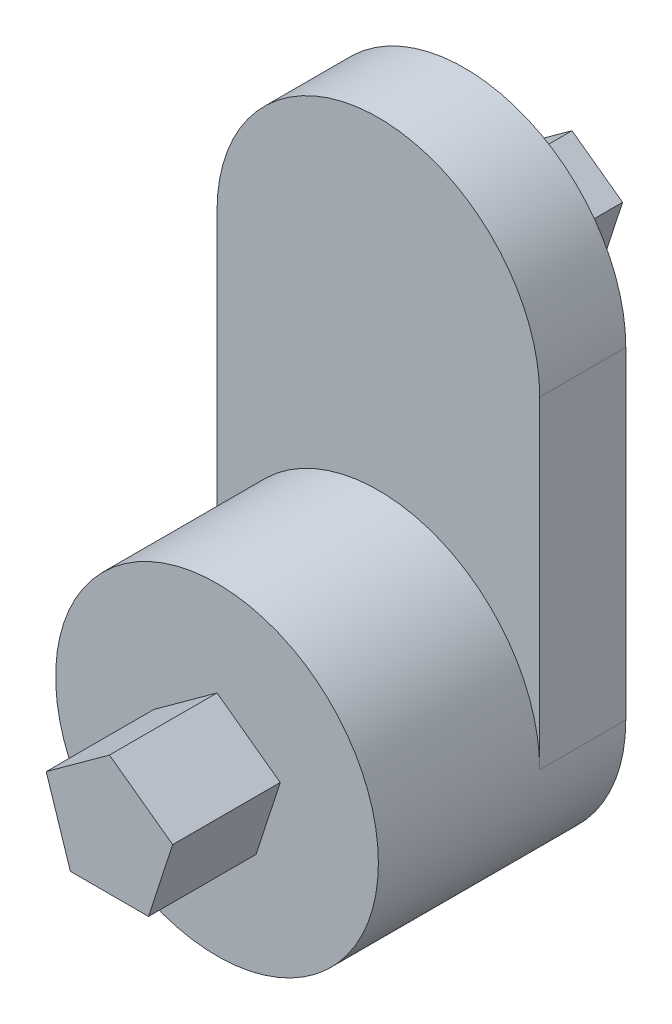
ISO-10303-21;
HEADER;
FILE_DESCRIPTION(('STEP AP214'),'2;1');
FILE_NAME('part.step','',(''),(''),'','','');
FILE_SCHEMA(('AUTOMOTIVE_DESIGN { 1 0 10303 214 1 1 1 1 }'));
ENDSEC;
DATA;
#1=APPLICATION_CONTEXT('core data for automotive mechanical design processes');
#2=APPLICATION_PROTOCOL_DEFINITION('international standard','automotive_design',2000,#1);
#3=PRODUCT_CONTEXT('',#1,'mechanical');
#4=PRODUCT('Part','Part','',(#3));
#5=PRODUCT_RELATED_PRODUCT_CATEGORY('part','',(#4));
#6=PRODUCT_DEFINITION_FORMATION('','',#4);
#7=PRODUCT_DEFINITION_CONTEXT('part definition',#1,'design');
#8=PRODUCT_DEFINITION('design','',#6,#7);
#9=PRODUCT_DEFINITION_SHAPE('','',#8);
#10=(LENGTH_UNIT() NAMED_UNIT(*) SI_UNIT(.MILLI.,.METRE.));
#11=(NAMED_UNIT(*) PLANE_ANGLE_UNIT() SI_UNIT($,.RADIAN.));
#12=(NAMED_UNIT(*) SI_UNIT($,.STERADIAN.) SOLID_ANGLE_UNIT());
#13=UNCERTAINTY_MEASURE_WITH_UNIT(LENGTH_MEASURE(1.E-05),#10,'distance_accuracy_value','');
#14=(GEOMETRIC_REPRESENTATION_CONTEXT(3) GLOBAL_UNCERTAINTY_ASSIGNED_CONTEXT((#13)) GLOBAL_UNIT_ASSIGNED_CONTEXT((#10,
#11,#12)) REPRESENTATION_CONTEXT('',''));
#15=CARTESIAN_POINT('',(0.,0.,0.));
#16=DIRECTION('',(0.,0.,1.));
#17=DIRECTION('',(1.,0.,0.));
#18=AXIS2_PLACEMENT_3D('',#15,#16,#17);
#19=CARTESIAN_POINT('',(0.,0.,-25.));
#20=DIRECTION('',(0.,0.,1.));
#21=DIRECTION('',(1.,0.,0.));
#22=AXIS2_PLACEMENT_3D('',#19,#20,#21);
#23=CYLINDRICAL_SURFACE('',#22,15.);
#24=CARTESIAN_POINT('',(0.,0.,-25.));
#25=DIRECTION('',(0.,0.,1.));
#26=DIRECTION('',(1.,0.,0.));
#27=AXIS2_PLACEMENT_3D('',#24,#25,#26);
#28=CIRCLE('',#27,15.);
#29=CARTESIAN_POINT('',(15.,0.,-25.));
#30=VERTEX_POINT('',#29);
#31=CARTESIAN_POINT('',(-15.,0.,-25.));
#32=VERTEX_POINT('',#31);
#33=EDGE_CURVE('E12',#30,#32,#28,.T.);
#34=ORIENTED_EDGE('',*,*,#33,.T.);
#35=DIRECTION('',(0.,0.,1.));
#36=VECTOR('',#35,1.);
#37=CARTESIAN_POINT('',(-15.,0.,-33.));
#38=LINE('',#37,#36);
#39=CARTESIAN_POINT('',(-15.,0.,-33.));
#40=VERTEX_POINT('',#39);
#41=EDGE_CURVE('E262',#40,#32,#38,.T.);
#42=ORIENTED_EDGE('',*,*,#41,.F.);
#43=CARTESIAN_POINT('',(0.,0.,-33.));
#44=DIRECTION('',(0.,0.,-1.));
#45=DIRECTION('',(-1.,0.,0.));
#46=AXIS2_PLACEMENT_3D('',#43,#44,#45);
#47=CIRCLE('',#46,15.);
#48=CARTESIAN_POINT('',(15.,0.,-33.));
#49=VERTEX_POINT('',#48);
#50=EDGE_CURVE('E241',#49,#40,#47,.T.);
#51=ORIENTED_EDGE('',*,*,#50,.F.);
#52=DIRECTION('',(0.,0.,1.));
#53=VECTOR('',#52,1.);
#54=CARTESIAN_POINT('',(15.,0.,-33.));
#55=LINE('',#54,#53);
#56=EDGE_CURVE('E264',#49,#30,#55,.T.);
#57=ORIENTED_EDGE('',*,*,#56,.T.);
#58=EDGE_LOOP('',(#34,#42,#51,#57));
#59=FACE_BOUND('',#58,.T.);
#60=CARTESIAN_POINT('',(0.,0.,-10.));
#61=DIRECTION('',(0.,0.,1.));
#62=DIRECTION('',(1.,0.,0.));
#63=AXIS2_PLACEMENT_3D('',#60,#61,#62);
#64=CIRCLE('',#63,15.);
#65=CARTESIAN_POINT('',(15.,0.,-10.));
#66=VERTEX_POINT('',#65);
#67=EDGE_CURVE('E226',#66,#66,#64,.T.);
#68=ORIENTED_EDGE('',*,*,#67,.F.);
#69=EDGE_LOOP('',(#68));
#70=FACE_BOUND('',#69,.T.);
#71=ADVANCED_FACE('F68',(#59,#70),#23,.T.);
#72=CARTESIAN_POINT('',(0.,30.,-33.));
#73=DIRECTION('',(0.,0.,1.));
#74=DIRECTION('',(1.,0.,0.));
#75=AXIS2_PLACEMENT_3D('',#72,#73,#74);
#76=CYLINDRICAL_SURFACE('',#75,15.);
#77=CARTESIAN_POINT('',(0.,30.,-25.));
#78=DIRECTION('',(0.,0.,-1.));
#79=DIRECTION('',(-1.,0.,0.));
#80=AXIS2_PLACEMENT_3D('',#77,#78,#79);
#81=CIRCLE('',#80,15.);
#82=CARTESIAN_POINT('',(-15.,30.,-25.));
#83=VERTEX_POINT('',#82);
#84=CARTESIAN_POINT('',(15.,30.,-25.));
#85=VERTEX_POINT('',#84);
#86=EDGE_CURVE('E253',#83,#85,#81,.T.);
#87=ORIENTED_EDGE('',*,*,#86,.T.);
#88=DIRECTION('',(0.,0.,1.));
#89=VECTOR('',#88,1.);
#90=CARTESIAN_POINT('',(15.,30.,-33.));
#91=LINE('',#90,#89);
#92=CARTESIAN_POINT('',(15.,30.,-33.));
#93=VERTEX_POINT('',#92);
#94=EDGE_CURVE('E75',#93,#85,#91,.T.);
#95=ORIENTED_EDGE('',*,*,#94,.F.);
#96=CARTESIAN_POINT('',(0.,30.,-33.));
#97=DIRECTION('',(0.,0.,-1.));
#98=DIRECTION('',(-1.,0.,0.));
#99=AXIS2_PLACEMENT_3D('',#96,#97,#98);
#100=CIRCLE('',#99,15.);
#101=CARTESIAN_POINT('',(-15.,30.,-33.));
#102=VERTEX_POINT('',#101);
#103=EDGE_CURVE('E244',#102,#93,#100,.T.);
#104=ORIENTED_EDGE('',*,*,#103,.F.);
#105=DIRECTION('',(0.,0.,1.));
#106=VECTOR('',#105,1.);
#107=CARTESIAN_POINT('',(-15.,30.,-33.));
#108=LINE('',#107,#106);
#109=EDGE_CURVE('E252',#102,#83,#108,.T.);
#110=ORIENTED_EDGE('',*,*,#109,.T.);
#111=EDGE_LOOP('',(#87,#95,#104,#110));
#112=FACE_BOUND('',#111,.T.);
#113=ADVANCED_FACE('F282',(#112),#76,.T.);
#114=CARTESIAN_POINT('',(15.,0.,-33.));
#115=DIRECTION('',(1.,0.,0.));
#116=DIRECTION('',(0.,0.,-1.));
#117=AXIS2_PLACEMENT_3D('',#114,#115,#116);
#118=PLANE('',#117);
#119=DIRECTION('',(0.,1.,0.));
#120=VECTOR('',#119,1.);
#121=CARTESIAN_POINT('',(15.,0.,-25.));
#122=LINE('',#121,#120);
#123=EDGE_CURVE('E256',#30,#85,#122,.T.);
#124=ORIENTED_EDGE('',*,*,#123,.F.);
#125=ORIENTED_EDGE('',*,*,#56,.F.);
#126=DIRECTION('',(0.,1.,0.));
#127=VECTOR('',#126,1.);
#128=CARTESIAN_POINT('',(15.,0.,-33.));
#129=LINE('',#128,#127);
#130=EDGE_CURVE('E246',#49,#93,#129,.T.);
#131=ORIENTED_EDGE('',*,*,#130,.T.);
#132=ORIENTED_EDGE('',*,*,#94,.T.);
#133=EDGE_LOOP('',(#124,#125,#131,#132));
#134=FACE_BOUND('',#133,.T.);
#135=ADVANCED_FACE('F284',(#134),#118,.T.);
#136=CARTESIAN_POINT('',(-15.,0.,-33.));
#137=DIRECTION('',(1.,0.,0.));
#138=DIRECTION('',(0.,0.,-1.));
#139=AXIS2_PLACEMENT_3D('',#136,#137,#138);
#140=PLANE('',#139);
#141=DIRECTION('',(0.,1.,0.));
#142=VECTOR('',#141,1.);
#143=CARTESIAN_POINT('',(-15.,0.,-25.));
#144=LINE('',#143,#142);
#145=EDGE_CURVE('E247',#32,#83,#144,.T.);
#146=ORIENTED_EDGE('',*,*,#145,.T.);
#147=ORIENTED_EDGE('',*,*,#109,.F.);
#148=DIRECTION('',(0.,1.,0.));
#149=VECTOR('',#148,1.);
#150=CARTESIAN_POINT('',(-15.,0.,-33.));
#151=LINE('',#150,#149);
#152=EDGE_CURVE('E250',#40,#102,#151,.T.);
#153=ORIENTED_EDGE('',*,*,#152,.F.);
#154=ORIENTED_EDGE('',*,*,#41,.T.);
#155=EDGE_LOOP('',(#146,#147,#153,#154));
#156=FACE_BOUND('',#155,.T.);
#157=ADVANCED_FACE('F276',(#156),#140,.F.);
#158=CARTESIAN_POINT('',(0.,0.,-25.));
#159=DIRECTION('',(0.,0.,-1.));
#160=DIRECTION('',(-1.,0.,0.));
#161=AXIS2_PLACEMENT_3D('',#158,#159,#160);
#162=PLANE('',#161);
#163=ORIENTED_EDGE('',*,*,#33,.F.);
#164=ORIENTED_EDGE('',*,*,#123,.T.);
#165=ORIENTED_EDGE('',*,*,#86,.F.);
#166=ORIENTED_EDGE('',*,*,#145,.F.);
#167=EDGE_LOOP('',(#163,#164,#165,#166));
#168=FACE_BOUND('',#167,.T.);
#169=ADVANCED_FACE('F288',(#168),#162,.F.);
#170=CARTESIAN_POINT('',(0.,0.,-33.));
#171=DIRECTION('',(0.,0.,-1.));
#172=DIRECTION('',(-1.,0.,0.));
#173=AXIS2_PLACEMENT_3D('',#170,#171,#172);
#174=PLANE('',#173);
#175=CARTESIAN_POINT('',(0.,30.,-33.));
#176=DIRECTION('',(0.,0.,-1.));
#177=DIRECTION('',(-1.,0.,0.));
#178=AXIS2_PLACEMENT_3D('',#175,#176,#177);
#179=CIRCLE('',#178,7.5);
#180=CARTESIAN_POINT('',(-7.5,30.,-33.));
#181=VERTEX_POINT('',#180);
#182=EDGE_CURVE('E237',#181,#181,#179,.T.);
#183=ORIENTED_EDGE('',*,*,#182,.F.);
#184=EDGE_LOOP('',(#183));
#185=FACE_BOUND('',#184,.T.);
#186=ORIENTED_EDGE('',*,*,#130,.F.);
#187=ORIENTED_EDGE('',*,*,#50,.T.);
#188=ORIENTED_EDGE('',*,*,#152,.T.);
#189=ORIENTED_EDGE('',*,*,#103,.T.);
#190=EDGE_LOOP('',(#186,#187,#188,#189));
#191=FACE_BOUND('',#190,.T.);
#192=ADVANCED_FACE('F272',(#185,#191),#174,.T.);
#193=CARTESIAN_POINT('',(0.,30.,-38.));
#194=DIRECTION('',(0.,0.,1.));
#195=DIRECTION('',(1.,0.,0.));
#196=AXIS2_PLACEMENT_3D('',#193,#194,#195);
#197=CYLINDRICAL_SURFACE('',#196,7.5);
#198=CARTESIAN_POINT('',(0.,30.,-38.));
#199=DIRECTION('',(0.,0.,-1.));
#200=DIRECTION('',(-1.,0.,0.));
#201=AXIS2_PLACEMENT_3D('',#198,#199,#200);
#202=CIRCLE('',#201,7.5);
#203=CARTESIAN_POINT('',(-7.5,30.,-38.));
#204=VERTEX_POINT('',#203);
#205=EDGE_CURVE('E238',#204,#204,#202,.T.);
#206=ORIENTED_EDGE('',*,*,#205,.F.);
#207=EDGE_LOOP('',(#206));
#208=FACE_BOUND('',#207,.T.);
#209=ORIENTED_EDGE('',*,*,#182,.T.);
#210=EDGE_LOOP('',(#209));
#211=FACE_BOUND('',#210,.T.);
#212=ADVANCED_FACE('F295',(#208,#211),#197,.T.);
#213=CARTESIAN_POINT('',(0.,30.,-38.));
#214=DIRECTION('',(0.,0.,-1.));
#215=DIRECTION('',(-1.,0.,0.));
#216=AXIS2_PLACEMENT_3D('',#213,#214,#215);
#217=PLANE('',#216);
#218=DIRECTION('',(0.809016994374948,0.587785252292473,0.));
#219=VECTOR('',#218,1.);
#220=CARTESIAN_POINT('',(-4.70228201833979,31.5278640450004,-38.));
#221=LINE('',#220,#219);
#222=CARTESIAN_POINT('',(-4.70228201833979,31.5278640450004,-38.));
#223=VERTEX_POINT('',#222);
#224=CARTESIAN_POINT('',(0.,34.9442719099992,-38.));
#225=VERTEX_POINT('',#224);
#226=EDGE_CURVE('E82',#223,#225,#221,.T.);
#227=ORIENTED_EDGE('',*,*,#226,.F.);
#228=DIRECTION('',(-0.309016994374947,0.951056516295154,0.));
#229=VECTOR('',#228,1.);
#230=CARTESIAN_POINT('',(-2.90617011202145,26.,-38.));
#231=LINE('',#230,#229);
#232=CARTESIAN_POINT('',(-2.90617011202145,26.,-38.));
#233=VERTEX_POINT('',#232);
#234=EDGE_CURVE('E86',#233,#223,#231,.T.);
#235=ORIENTED_EDGE('',*,*,#234,.F.);
#236=DIRECTION('',(-1.,0.,0.));
#237=VECTOR('',#236,1.);
#238=CARTESIAN_POINT('',(2.90617011202144,26.,-38.));
#239=LINE('',#238,#237);
#240=CARTESIAN_POINT('',(2.90617011202144,26.,-38.));
#241=VERTEX_POINT('',#240);
#242=EDGE_CURVE('E475',#241,#233,#239,.T.);
#243=ORIENTED_EDGE('',*,*,#242,.F.);
#244=DIRECTION('',(-0.309016994374947,-0.951056516295154,0.));
#245=VECTOR('',#244,1.);
#246=CARTESIAN_POINT('',(4.70228201833979,31.5278640450004,-38.));
#247=LINE('',#246,#245);
#248=CARTESIAN_POINT('',(4.70228201833979,31.5278640450004,-38.));
#249=VERTEX_POINT('',#248);
#250=EDGE_CURVE('E486',#249,#241,#247,.T.);
#251=ORIENTED_EDGE('',*,*,#250,.F.);
#252=DIRECTION('',(0.809016994374947,-0.587785252292473,0.));
#253=VECTOR('',#252,1.);
#254=CARTESIAN_POINT('',(0.,34.9442719099992,-38.));
#255=LINE('',#254,#253);
#256=EDGE_CURVE('E487',#225,#249,#255,.T.);
#257=ORIENTED_EDGE('',*,*,#256,.F.);
#258=EDGE_LOOP('',(#227,#235,#243,#251,#257));
#259=FACE_BOUND('',#258,.T.);
#260=ORIENTED_EDGE('',*,*,#205,.T.);
#261=EDGE_LOOP('',(#260));
#262=FACE_BOUND('',#261,.T.);
#263=ADVANCED_FACE('F340',(#259,#262),#217,.T.);
#264=CARTESIAN_POINT('',(0.,0.,-10.));
#265=DIRECTION('',(0.,0.,1.));
#266=DIRECTION('',(1.,0.,0.));
#267=AXIS2_PLACEMENT_3D('',#264,#265,#266);
#268=PLANE('',#267);
#269=DIRECTION('',(0.309016994374947,0.951056516295154,0.));
#270=VECTOR('',#269,1.);
#271=CARTESIAN_POINT('',(3.63271264002681,-5.,-10.));
#272=LINE('',#271,#270);
#273=CARTESIAN_POINT('',(3.63271264002681,-5.,-10.));
#274=VERTEX_POINT('',#273);
#275=CARTESIAN_POINT('',(5.87785252292473,1.90983005625053,-10.));
#276=VERTEX_POINT('',#275);
#277=EDGE_CURVE('E210',#274,#276,#272,.T.);
#278=ORIENTED_EDGE('',*,*,#277,.F.);
#279=DIRECTION('',(1.,0.,0.));
#280=VECTOR('',#279,1.);
#281=CARTESIAN_POINT('',(-3.63271264002681,-5.,-10.));
#282=LINE('',#281,#280);
#283=CARTESIAN_POINT('',(-3.63271264002681,-5.,-10.));
#284=VERTEX_POINT('',#283);
#285=EDGE_CURVE('E207',#284,#274,#282,.T.);
#286=ORIENTED_EDGE('',*,*,#285,.F.);
#287=DIRECTION('',(0.309016994374947,-0.951056516295154,0.));
#288=VECTOR('',#287,1.);
#289=CARTESIAN_POINT('',(-5.87785252292473,1.90983005625053,-10.));
#290=LINE('',#289,#288);
#291=CARTESIAN_POINT('',(-5.87785252292473,1.90983005625052,-10.));
#292=VERTEX_POINT('',#291);
#293=EDGE_CURVE('E204',#292,#284,#290,.T.);
#294=ORIENTED_EDGE('',*,*,#293,.F.);
#295=DIRECTION('',(-0.809016994374947,-0.587785252292473,0.));
#296=VECTOR('',#295,1.);
#297=CARTESIAN_POINT('',(0.,6.18033988749895,-10.));
#298=LINE('',#297,#296);
#299=CARTESIAN_POINT('',(0.,6.18033988749895,-10.));
#300=VERTEX_POINT('',#299);
#301=EDGE_CURVE('E200',#300,#292,#298,.T.);
#302=ORIENTED_EDGE('',*,*,#301,.F.);
#303=DIRECTION('',(-0.809016994374947,0.587785252292473,0.));
#304=VECTOR('',#303,1.);
#305=CARTESIAN_POINT('',(5.87785252292473,1.90983005625053,-10.));
#306=LINE('',#305,#304);
#307=EDGE_CURVE('E197',#276,#300,#306,.T.);
#308=ORIENTED_EDGE('',*,*,#307,.F.);
#309=EDGE_LOOP('',(#278,#286,#294,#302,#308));
#310=FACE_BOUND('',#309,.T.);
#311=ORIENTED_EDGE('',*,*,#67,.T.);
#312=EDGE_LOOP('',(#311));
#313=FACE_BOUND('',#312,.T.);
#314=ADVANCED_FACE('F337',(#310,#313),#268,.T.);
#315=CARTESIAN_POINT('',(5.87785252292473,1.90983005625053,-10.));
#316=DIRECTION('',(0.587785252292473,0.809016994374947,0.));
#317=DIRECTION('',(-0.809016994374948,0.587785252292473,0.));
#318=AXIS2_PLACEMENT_3D('',#315,#316,#317);
#319=PLANE('',#318);
#320=DIRECTION('',(-0.809016994374947,0.587785252292473,0.));
#321=VECTOR('',#320,1.);
#322=CARTESIAN_POINT('',(5.87785252292473,1.90983005625053,0.));
#323=LINE('',#322,#321);
#324=CARTESIAN_POINT('',(5.87785252292473,1.90983005625053,0.));
#325=VERTEX_POINT('',#324);
#326=CARTESIAN_POINT('',(0.,6.18033988749895,0.));
#327=VERTEX_POINT('',#326);
#328=EDGE_CURVE('E188',#325,#327,#323,.T.);
#329=ORIENTED_EDGE('',*,*,#328,.F.);
#330=DIRECTION('',(0.,0.,1.));
#331=VECTOR('',#330,1.);
#332=CARTESIAN_POINT('',(5.87785252292473,1.90983005625053,-10.));
#333=LINE('',#332,#331);
#334=EDGE_CURVE('E224',#276,#325,#333,.T.);
#335=ORIENTED_EDGE('',*,*,#334,.F.);
#336=ORIENTED_EDGE('',*,*,#307,.T.);
#337=DIRECTION('',(0.,0.,1.));
#338=VECTOR('',#337,1.);
#339=CARTESIAN_POINT('',(0.,6.18033988749895,-10.));
#340=LINE('',#339,#338);
#341=EDGE_CURVE('E212',#300,#327,#340,.T.);
#342=ORIENTED_EDGE('',*,*,#341,.T.);
#343=EDGE_LOOP('',(#329,#335,#336,#342));
#344=FACE_BOUND('',#343,.T.);
#345=ADVANCED_FACE('F328',(#344),#319,.T.);
#346=CARTESIAN_POINT('',(3.63271264002681,-5.,-10.));
#347=DIRECTION('',(0.951056516295154,-0.309016994374947,0.));
#348=DIRECTION('',(0.309016994374947,0.951056516295154,0.));
#349=AXIS2_PLACEMENT_3D('',#346,#347,#348);
#350=PLANE('',#349);
#351=DIRECTION('',(0.309016994374947,0.951056516295154,0.));
#352=VECTOR('',#351,1.);
#353=CARTESIAN_POINT('',(3.63271264002681,-5.,0.));
#354=LINE('',#353,#352);
#355=CARTESIAN_POINT('',(3.63271264002681,-5.,0.));
#356=VERTEX_POINT('',#355);
#357=EDGE_CURVE('E201',#356,#325,#354,.T.);
#358=ORIENTED_EDGE('',*,*,#357,.F.);
#359=DIRECTION('',(0.,0.,1.));
#360=VECTOR('',#359,1.);
#361=CARTESIAN_POINT('',(3.63271264002681,-5.,-10.));
#362=LINE('',#361,#360);
#363=EDGE_CURVE('E227',#274,#356,#362,.T.);
#364=ORIENTED_EDGE('',*,*,#363,.F.);
#365=ORIENTED_EDGE('',*,*,#277,.T.);
#366=ORIENTED_EDGE('',*,*,#334,.T.);
#367=EDGE_LOOP('',(#358,#364,#365,#366));
#368=FACE_BOUND('',#367,.T.);
#369=ADVANCED_FACE('F324',(#368),#350,.T.);
#370=CARTESIAN_POINT('',(-3.63271264002681,-5.,-10.));
#371=DIRECTION('',(0.,-1.,0.));
#372=DIRECTION('',(1.,0.,0.));
#373=AXIS2_PLACEMENT_3D('',#370,#371,#372);
#374=PLANE('',#373);
#375=DIRECTION('',(1.,0.,0.));
#376=VECTOR('',#375,1.);
#377=CARTESIAN_POINT('',(-3.63271264002681,-5.,0.));
#378=LINE('',#377,#376);
#379=CARTESIAN_POINT('',(-3.63271264002681,-5.,0.));
#380=VERTEX_POINT('',#379);
#381=EDGE_CURVE('E219',#380,#356,#378,.T.);
#382=ORIENTED_EDGE('',*,*,#381,.F.);
#383=DIRECTION('',(0.,0.,1.));
#384=VECTOR('',#383,1.);
#385=CARTESIAN_POINT('',(-3.63271264002681,-5.,-10.));
#386=LINE('',#385,#384);
#387=EDGE_CURVE('E229',#284,#380,#386,.T.);
#388=ORIENTED_EDGE('',*,*,#387,.F.);
#389=ORIENTED_EDGE('',*,*,#285,.T.);
#390=ORIENTED_EDGE('',*,*,#363,.T.);
#391=EDGE_LOOP('',(#382,#388,#389,#390));
#392=FACE_BOUND('',#391,.T.);
#393=ADVANCED_FACE('F335',(#392),#374,.T.);
#394=CARTESIAN_POINT('',(-5.87785252292473,1.90983005625053,-10.));
#395=DIRECTION('',(-0.951056516295154,-0.309016994374947,0.));
#396=DIRECTION('',(0.309016994374947,-0.951056516295154,0.));
#397=AXIS2_PLACEMENT_3D('',#394,#395,#396);
#398=PLANE('',#397);
#399=DIRECTION('',(0.309016994374947,-0.951056516295154,0.));
#400=VECTOR('',#399,1.);
#401=CARTESIAN_POINT('',(-5.87785252292473,1.90983005625053,0.));
#402=LINE('',#401,#400);
#403=CARTESIAN_POINT('',(-5.87785252292473,1.90983005625052,0.));
#404=VERTEX_POINT('',#403);
#405=EDGE_CURVE('E216',#404,#380,#402,.T.);
#406=ORIENTED_EDGE('',*,*,#405,.F.);
#407=DIRECTION('',(0.,0.,1.));
#408=VECTOR('',#407,1.);
#409=CARTESIAN_POINT('',(-5.87785252292473,1.90983005625053,-10.));
#410=LINE('',#409,#408);
#411=EDGE_CURVE('E231',#292,#404,#410,.T.);
#412=ORIENTED_EDGE('',*,*,#411,.F.);
#413=ORIENTED_EDGE('',*,*,#293,.T.);
#414=ORIENTED_EDGE('',*,*,#387,.T.);
#415=EDGE_LOOP('',(#406,#412,#413,#414));
#416=FACE_BOUND('',#415,.T.);
#417=ADVANCED_FACE('F317',(#416),#398,.T.);
#418=CARTESIAN_POINT('',(0.,6.18033988749895,-10.));
#419=DIRECTION('',(-0.587785252292473,0.809016994374947,0.));
#420=DIRECTION('',(-0.809016994374948,-0.587785252292473,0.));
#421=AXIS2_PLACEMENT_3D('',#418,#419,#420);
#422=PLANE('',#421);
#423=DIRECTION('',(-0.809016994374947,-0.587785252292473,0.));
#424=VECTOR('',#423,1.);
#425=CARTESIAN_POINT('',(0.,6.18033988749895,0.));
#426=LINE('',#425,#424);
#427=EDGE_CURVE('E191',#327,#404,#426,.T.);
#428=ORIENTED_EDGE('',*,*,#427,.F.);
#429=ORIENTED_EDGE('',*,*,#341,.F.);
#430=ORIENTED_EDGE('',*,*,#301,.T.);
#431=ORIENTED_EDGE('',*,*,#411,.T.);
#432=EDGE_LOOP('',(#428,#429,#430,#431));
#433=FACE_BOUND('',#432,.T.);
#434=ADVANCED_FACE('F310',(#433),#422,.T.);
#435=CARTESIAN_POINT('',(0.,0.,0.));
#436=DIRECTION('',(0.,0.,1.));
#437=DIRECTION('',(1.,0.,0.));
#438=AXIS2_PLACEMENT_3D('',#435,#436,#437);
#439=PLANE('',#438);
#440=ORIENTED_EDGE('',*,*,#357,.T.);
#441=ORIENTED_EDGE('',*,*,#328,.T.);
#442=ORIENTED_EDGE('',*,*,#427,.T.);
#443=ORIENTED_EDGE('',*,*,#405,.T.);
#444=ORIENTED_EDGE('',*,*,#381,.T.);
#445=EDGE_LOOP('',(#440,#441,#442,#443,#444));
#446=FACE_BOUND('',#445,.T.);
#447=ADVANCED_FACE('F308',(#446),#439,.T.);
#448=CARTESIAN_POINT('',(-4.70228201833979,31.5278640450004,-43.));
#449=DIRECTION('',(0.587785252292473,-0.809016994374948,0.));
#450=DIRECTION('',(0.809016994374948,0.587785252292473,0.));
#451=AXIS2_PLACEMENT_3D('',#448,#449,#450);
#452=PLANE('',#451);
#453=ORIENTED_EDGE('',*,*,#226,.T.);
#454=DIRECTION('',(0.,0.,1.));
#455=VECTOR('',#454,1.);
#456=CARTESIAN_POINT('',(0.,34.9442719099992,-43.));
#457=LINE('',#456,#455);
#458=CARTESIAN_POINT('',(0.,34.9442719099992,-43.));
#459=VERTEX_POINT('',#458);
#460=EDGE_CURVE('E171',#459,#225,#457,.T.);
#461=ORIENTED_EDGE('',*,*,#460,.F.);
#462=DIRECTION('',(0.809016994374948,0.587785252292473,0.));
#463=VECTOR('',#462,1.);
#464=CARTESIAN_POINT('',(-4.70228201833979,31.5278640450004,-43.));
#465=LINE('',#464,#463);
#466=CARTESIAN_POINT('',(-4.70228201833979,31.5278640450004,-43.));
#467=VERTEX_POINT('',#466);
#468=EDGE_CURVE('E177',#467,#459,#465,.T.);
#469=ORIENTED_EDGE('',*,*,#468,.F.);
#470=DIRECTION('',(0.,0.,1.));
#471=VECTOR('',#470,1.);
#472=CARTESIAN_POINT('',(-4.70228201833979,31.5278640450004,-43.));
#473=LINE('',#472,#471);
#474=EDGE_CURVE('E472',#467,#223,#473,.T.);
#475=ORIENTED_EDGE('',*,*,#474,.T.);
#476=EDGE_LOOP('',(#453,#461,#469,#475));
#477=FACE_BOUND('',#476,.T.);
#478=ADVANCED_FACE('F187',(#477),#452,.F.);
#479=CARTESIAN_POINT('',(0.,34.9442719099992,-43.));
#480=DIRECTION('',(-0.587785252292473,-0.809016994374947,0.));
#481=DIRECTION('',(0.809016994374947,-0.587785252292473,0.));
#482=AXIS2_PLACEMENT_3D('',#479,#480,#481);
#483=PLANE('',#482);
#484=ORIENTED_EDGE('',*,*,#256,.T.);
#485=DIRECTION('',(0.,0.,1.));
#486=VECTOR('',#485,1.);
#487=CARTESIAN_POINT('',(4.70228201833979,31.5278640450004,-43.));
#488=LINE('',#487,#486);
#489=CARTESIAN_POINT('',(4.70228201833979,31.5278640450004,-43.));
#490=VERTEX_POINT('',#489);
#491=EDGE_CURVE('E173',#490,#249,#488,.T.);
#492=ORIENTED_EDGE('',*,*,#491,.F.);
#493=DIRECTION('',(0.809016994374947,-0.587785252292473,0.));
#494=VECTOR('',#493,1.);
#495=CARTESIAN_POINT('',(0.,34.9442719099992,-43.));
#496=LINE('',#495,#494);
#497=EDGE_CURVE('E166',#459,#490,#496,.T.);
#498=ORIENTED_EDGE('',*,*,#497,.F.);
#499=ORIENTED_EDGE('',*,*,#460,.T.);
#500=EDGE_LOOP('',(#484,#492,#498,#499));
#501=FACE_BOUND('',#500,.T.);
#502=ADVANCED_FACE('F169',(#501),#483,.F.);
#503=CARTESIAN_POINT('',(4.70228201833979,31.5278640450004,-43.));
#504=DIRECTION('',(-0.951056516295154,0.309016994374947,0.));
#505=DIRECTION('',(-0.309016994374947,-0.951056516295154,0.));
#506=AXIS2_PLACEMENT_3D('',#503,#504,#505);
#507=PLANE('',#506);
#508=ORIENTED_EDGE('',*,*,#250,.T.);
#509=DIRECTION('',(0.,0.,1.));
#510=VECTOR('',#509,1.);
#511=CARTESIAN_POINT('',(2.90617011202144,26.,-43.));
#512=LINE('',#511,#510);
#513=CARTESIAN_POINT('',(2.90617011202144,26.,-43.));
#514=VERTEX_POINT('',#513);
#515=EDGE_CURVE('E193',#514,#241,#512,.T.);
#516=ORIENTED_EDGE('',*,*,#515,.F.);
#517=DIRECTION('',(-0.309016994374947,-0.951056516295154,0.));
#518=VECTOR('',#517,1.);
#519=CARTESIAN_POINT('',(4.70228201833979,31.5278640450004,-43.));
#520=LINE('',#519,#518);
#521=EDGE_CURVE('E176',#490,#514,#520,.T.);
#522=ORIENTED_EDGE('',*,*,#521,.F.);
#523=ORIENTED_EDGE('',*,*,#491,.T.);
#524=EDGE_LOOP('',(#508,#516,#522,#523));
#525=FACE_BOUND('',#524,.T.);
#526=ADVANCED_FACE('F383',(#525),#507,.F.);
#527=CARTESIAN_POINT('',(2.90617011202144,26.,-43.));
#528=DIRECTION('',(0.,1.,0.));
#529=DIRECTION('',(-1.,0.,0.));
#530=AXIS2_PLACEMENT_3D('',#527,#528,#529);
#531=PLANE('',#530);
#532=ORIENTED_EDGE('',*,*,#242,.T.);
#533=DIRECTION('',(0.,0.,1.));
#534=VECTOR('',#533,1.);
#535=CARTESIAN_POINT('',(-2.90617011202145,26.,-43.));
#536=LINE('',#535,#534);
#537=CARTESIAN_POINT('',(-2.90617011202145,26.,-43.));
#538=VERTEX_POINT('',#537);
#539=EDGE_CURVE('E474',#538,#233,#536,.T.);
#540=ORIENTED_EDGE('',*,*,#539,.F.);
#541=DIRECTION('',(-1.,0.,0.));
#542=VECTOR('',#541,1.);
#543=CARTESIAN_POINT('',(2.90617011202144,26.,-43.));
#544=LINE('',#543,#542);
#545=EDGE_CURVE('E479',#514,#538,#544,.T.);
#546=ORIENTED_EDGE('',*,*,#545,.F.);
#547=ORIENTED_EDGE('',*,*,#515,.T.);
#548=EDGE_LOOP('',(#532,#540,#546,#547));
#549=FACE_BOUND('',#548,.T.);
#550=ADVANCED_FACE('F392',(#549),#531,.F.);
#551=CARTESIAN_POINT('',(-2.90617011202145,26.,-43.));
#552=DIRECTION('',(0.951056516295154,0.309016994374947,0.));
#553=DIRECTION('',(-0.309016994374947,0.951056516295154,0.));
#554=AXIS2_PLACEMENT_3D('',#551,#552,#553);
#555=PLANE('',#554);
#556=ORIENTED_EDGE('',*,*,#234,.T.);
#557=ORIENTED_EDGE('',*,*,#474,.F.);
#558=DIRECTION('',(-0.309016994374947,0.951056516295154,0.));
#559=VECTOR('',#558,1.);
#560=CARTESIAN_POINT('',(-2.90617011202145,26.,-43.));
#561=LINE('',#560,#559);
#562=EDGE_CURVE('E182',#538,#467,#561,.T.);
#563=ORIENTED_EDGE('',*,*,#562,.F.);
#564=ORIENTED_EDGE('',*,*,#539,.T.);
#565=EDGE_LOOP('',(#556,#557,#563,#564));
#566=FACE_BOUND('',#565,.T.);
#567=ADVANCED_FACE('F402',(#566),#555,.F.);
#568=CARTESIAN_POINT('',(0.,0.,-43.));
#569=DIRECTION('',(0.,0.,-1.));
#570=DIRECTION('',(-1.,0.,0.));
#571=AXIS2_PLACEMENT_3D('',#568,#569,#570);
#572=PLANE('',#571);
#573=ORIENTED_EDGE('',*,*,#468,.T.);
#574=ORIENTED_EDGE('',*,*,#497,.T.);
#575=ORIENTED_EDGE('',*,*,#521,.T.);
#576=ORIENTED_EDGE('',*,*,#545,.T.);
#577=ORIENTED_EDGE('',*,*,#562,.T.);
#578=EDGE_LOOP('',(#573,#574,#575,#576,#577));
#579=FACE_BOUND('',#578,.T.);
#580=ADVANCED_FACE('F180',(#579),#572,.T.);
#581=CLOSED_SHELL('',(#71,#113,#135,#157,#169,#192,#212,#263,#314,#345,#369,#393,#417,#434,#447,
#478,#502,#526,#550,#567,#580));
#582=MANIFOLD_SOLID_BREP('B2',#581);
#583=ADVANCED_BREP_SHAPE_REPRESENTATION('',(#18,#582),#14);
#584=SHAPE_DEFINITION_REPRESENTATION(#9,#583);
ENDSEC;
END-ISO-10303-21;
